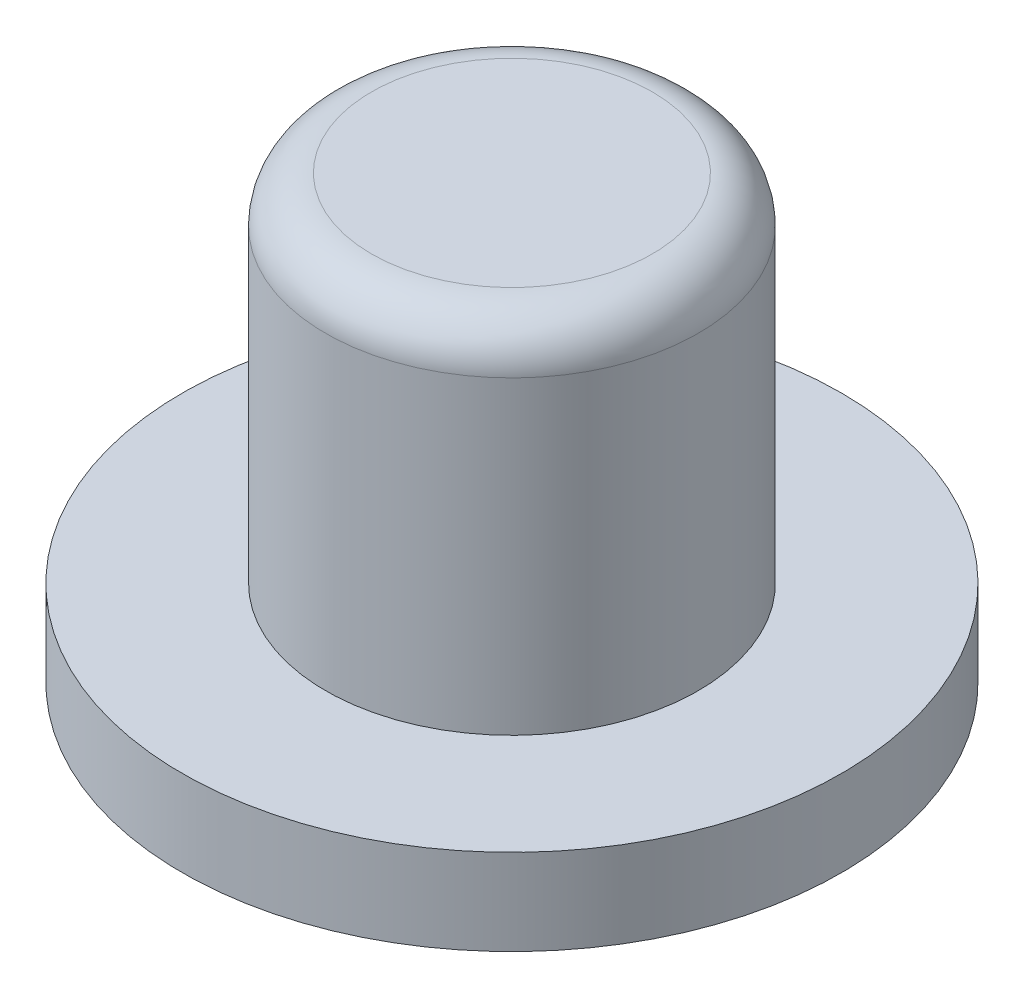
ISO-10303-21;
HEADER;
FILE_DESCRIPTION(('STEP AP214'),'2;1');
FILE_NAME('part.step','',(''),(''),'','','');
FILE_SCHEMA(('AUTOMOTIVE_DESIGN { 1 0 10303 214 1 1 1 1 }'));
ENDSEC;
DATA;
#1=APPLICATION_CONTEXT('core data for automotive mechanical design processes');
#2=APPLICATION_PROTOCOL_DEFINITION('international standard','automotive_design',2000,#1);
#3=PRODUCT_CONTEXT('',#1,'mechanical');
#4=PRODUCT('Part','Part','',(#3));
#5=PRODUCT_RELATED_PRODUCT_CATEGORY('part','',(#4));
#6=PRODUCT_DEFINITION_FORMATION('','',#4);
#7=PRODUCT_DEFINITION_CONTEXT('part definition',#1,'design');
#8=PRODUCT_DEFINITION('design','',#6,#7);
#9=PRODUCT_DEFINITION_SHAPE('','',#8);
#10=(LENGTH_UNIT() NAMED_UNIT(*) SI_UNIT(.MILLI.,.METRE.));
#11=(NAMED_UNIT(*) PLANE_ANGLE_UNIT() SI_UNIT($,.RADIAN.));
#12=(NAMED_UNIT(*) SI_UNIT($,.STERADIAN.) SOLID_ANGLE_UNIT());
#13=UNCERTAINTY_MEASURE_WITH_UNIT(LENGTH_MEASURE(1.E-05),#10,'distance_accuracy_value','');
#14=(GEOMETRIC_REPRESENTATION_CONTEXT(3) GLOBAL_UNCERTAINTY_ASSIGNED_CONTEXT((#13)) GLOBAL_UNIT_ASSIGNED_CONTEXT((#10,
#11,#12)) REPRESENTATION_CONTEXT('',''));
#15=CARTESIAN_POINT('',(0.,0.,0.));
#16=DIRECTION('',(0.,0.,1.));
#17=DIRECTION('',(1.,0.,0.));
#18=AXIS2_PLACEMENT_3D('',#15,#16,#17);
#19=CARTESIAN_POINT('',(0.,34.9840183432769,-1.05757295600294));
#20=DIRECTION('',(-1.,0.,0.));
#21=DIRECTION('',(0.,0.,-1.));
#22=AXIS2_PLACEMENT_3D('',#19,#20,#21);
#23=CIRCLE('',#22,35.);
#24=TRIMMED_CURVE('',#23,(PARAMETER_VALUE(-1.60101729692712)),
(PARAMETER_VALUE(1.60101729692712)),.T.,.PARAMETER.);
#25=CARTESIAN_POINT('',(0.,34.9840183432769,0.));
#26=DIRECTION('',(0.,-1.,0.));
#27=AXIS1_PLACEMENT('',#25,#26);
#28=SURFACE_OF_REVOLUTION('',#24,#27);
#29=CARTESIAN_POINT('',(0.,0.,0.));
#30=VERTEX_POINT('',#29);
#31=VERTEX_LOOP('',#30);
#32=FACE_BOUND('',#31,.T.);
#33=CARTESIAN_POINT('',(0.,0.3,0.));
#34=DIRECTION('',(0.,-1.,0.));
#35=DIRECTION('',(0.,0.,-1.));
#36=AXIS2_PLACEMENT_3D('',#33,#34,#35);
#37=CIRCLE('',#36,5.75);
#38=CARTESIAN_POINT('',(0.,0.3,-5.75));
#39=VERTEX_POINT('',#38);
#40=EDGE_CURVE('E52',#39,#39,#37,.T.);
#41=ORIENTED_EDGE('',*,*,#40,.T.);
#42=EDGE_LOOP('',(#41));
#43=FACE_BOUND('',#42,.T.);
#44=ADVANCED_FACE('F37',(#32,#43),#28,.T.);
#45=CARTESIAN_POINT('',(-3.25,8.,0.));
#46=DIRECTION('',(0.,-1.,0.));
#47=DIRECTION('',(0.,0.,-1.));
#48=AXIS2_PLACEMENT_3D('',#45,#46,#47);
#49=PLANE('',#48);
#50=CARTESIAN_POINT('',(0.,8.,0.));
#51=DIRECTION('',(0.,-1.,0.));
#52=DIRECTION('',(0.,0.,-1.));
#53=AXIS2_PLACEMENT_3D('',#50,#51,#52);
#54=CIRCLE('',#53,2.45);
#55=CARTESIAN_POINT('',(0.,8.,-2.45));
#56=VERTEX_POINT('',#55);
#57=EDGE_CURVE('E11',#56,#56,#54,.F.);
#58=ORIENTED_EDGE('',*,*,#57,.T.);
#59=EDGE_LOOP('',(#58));
#60=FACE_BOUND('',#59,.T.);
#61=ADVANCED_FACE('F49',(#60),#49,.F.);
#62=CARTESIAN_POINT('',(0.,0.,0.));
#63=DIRECTION('',(0.,-1.,0.));
#64=DIRECTION('',(0.,0.,-1.));
#65=AXIS2_PLACEMENT_3D('',#62,#63,#64);
#66=CYLINDRICAL_SURFACE('',#65,3.25);
#67=CARTESIAN_POINT('',(0.,7.2,0.));
#68=DIRECTION('',(0.,-1.,0.));
#69=DIRECTION('',(0.,0.,-1.));
#70=AXIS2_PLACEMENT_3D('',#67,#68,#69);
#71=CIRCLE('',#70,3.25);
#72=CARTESIAN_POINT('',(0.,7.2,-3.25));
#73=VERTEX_POINT('',#72);
#74=EDGE_CURVE('E44',#73,#73,#71,.T.);
#75=ORIENTED_EDGE('',*,*,#74,.T.);
#76=EDGE_LOOP('',(#75));
#77=FACE_BOUND('',#76,.T.);
#78=CARTESIAN_POINT('',(0.,1.8,0.));
#79=DIRECTION('',(0.,-1.,0.));
#80=DIRECTION('',(0.,0.,-1.));
#81=AXIS2_PLACEMENT_3D('',#78,#79,#80);
#82=CIRCLE('',#81,3.25);
#83=CARTESIAN_POINT('',(0.,1.8,-3.25));
#84=VERTEX_POINT('',#83);
#85=EDGE_CURVE('E57',#84,#84,#82,.T.);
#86=ORIENTED_EDGE('',*,*,#85,.F.);
#87=EDGE_LOOP('',(#86));
#88=FACE_BOUND('',#87,.T.);
#89=ADVANCED_FACE('F64',(#77,#88),#66,.T.);
#90=CARTESIAN_POINT('',(-5.75,1.8,0.));
#91=DIRECTION('',(0.,-1.,0.));
#92=DIRECTION('',(0.,0.,-1.));
#93=AXIS2_PLACEMENT_3D('',#90,#91,#92);
#94=PLANE('',#93);
#95=CARTESIAN_POINT('',(0.,1.8,0.));
#96=DIRECTION('',(0.,-1.,0.));
#97=DIRECTION('',(0.,0.,-1.));
#98=AXIS2_PLACEMENT_3D('',#95,#96,#97);
#99=CIRCLE('',#98,5.75);
#100=CARTESIAN_POINT('',(0.,1.8,-5.75));
#101=VERTEX_POINT('',#100);
#102=EDGE_CURVE('E54',#101,#101,#99,.T.);
#103=ORIENTED_EDGE('',*,*,#102,.F.);
#104=EDGE_LOOP('',(#103));
#105=FACE_BOUND('',#104,.T.);
#106=ORIENTED_EDGE('',*,*,#85,.T.);
#107=EDGE_LOOP('',(#106));
#108=FACE_BOUND('',#107,.T.);
#109=ADVANCED_FACE('F73',(#105,#108),#94,.F.);
#110=CARTESIAN_POINT('',(0.,0.,0.));
#111=DIRECTION('',(0.,-1.,0.));
#112=DIRECTION('',(0.,0.,-1.));
#113=AXIS2_PLACEMENT_3D('',#110,#111,#112);
#114=CYLINDRICAL_SURFACE('',#113,5.75);
#115=ORIENTED_EDGE('',*,*,#40,.F.);
#116=EDGE_LOOP('',(#115));
#117=FACE_BOUND('',#116,.T.);
#118=ORIENTED_EDGE('',*,*,#102,.T.);
#119=EDGE_LOOP('',(#118));
#120=FACE_BOUND('',#119,.T.);
#121=ADVANCED_FACE('F68',(#117,#120),#114,.T.);
#122=CARTESIAN_POINT('',(0.,7.2,0.));
#123=DIRECTION('',(0.,-1.,0.));
#124=DIRECTION('',(0.,0.,-1.));
#125=AXIS2_PLACEMENT_3D('',#122,#123,#124);
#126=TOROIDAL_SURFACE('',#125,2.45,0.8);
#127=ORIENTED_EDGE('',*,*,#57,.F.);
#128=EDGE_LOOP('',(#127));
#129=FACE_BOUND('',#128,.T.);
#130=ORIENTED_EDGE('',*,*,#74,.F.);
#131=EDGE_LOOP('',(#130));
#132=FACE_BOUND('',#131,.T.);
#133=ADVANCED_FACE('F39',(#129,#132),#126,.T.);
#134=CLOSED_SHELL('',(#44,#61,#89,#109,#121,#133));
#135=MANIFOLD_SOLID_BREP('B2',#134);
#136=ADVANCED_BREP_SHAPE_REPRESENTATION('',(#18,#135),#14);
#137=SHAPE_DEFINITION_REPRESENTATION(#9,#136);
ENDSEC;
END-ISO-10303-21;
